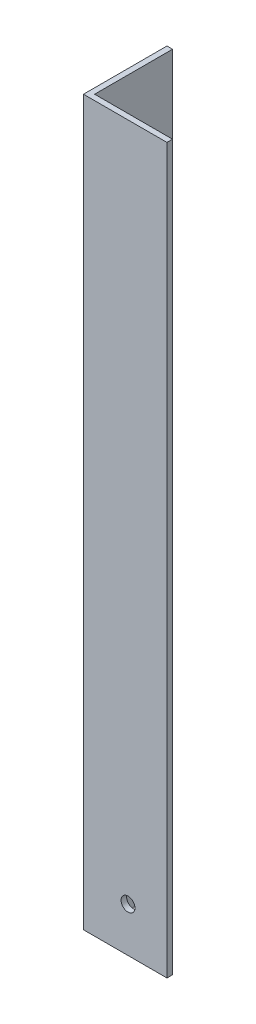
ISO-10303-21;
HEADER;
FILE_DESCRIPTION(('STEP AP214'),'2;1');
FILE_NAME('part.step','',(''),(''),'','','');
FILE_SCHEMA(('AUTOMOTIVE_DESIGN { 1 0 10303 214 1 1 1 1 }'));
ENDSEC;
DATA;
#1=APPLICATION_CONTEXT('core data for automotive mechanical design processes');
#2=APPLICATION_PROTOCOL_DEFINITION('international standard','automotive_design',2000,#1);
#3=PRODUCT_CONTEXT('',#1,'mechanical');
#4=PRODUCT('Part','Part','',(#3));
#5=PRODUCT_RELATED_PRODUCT_CATEGORY('part','',(#4));
#6=PRODUCT_DEFINITION_FORMATION('','',#4);
#7=PRODUCT_DEFINITION_CONTEXT('part definition',#1,'design');
#8=PRODUCT_DEFINITION('design','',#6,#7);
#9=PRODUCT_DEFINITION_SHAPE('','',#8);
#10=(LENGTH_UNIT() NAMED_UNIT(*) SI_UNIT(.MILLI.,.METRE.));
#11=(NAMED_UNIT(*) PLANE_ANGLE_UNIT() SI_UNIT($,.RADIAN.));
#12=(NAMED_UNIT(*) SI_UNIT($,.STERADIAN.) SOLID_ANGLE_UNIT());
#13=UNCERTAINTY_MEASURE_WITH_UNIT(LENGTH_MEASURE(1.E-05),#10,'distance_accuracy_value','');
#14=(GEOMETRIC_REPRESENTATION_CONTEXT(3) GLOBAL_UNCERTAINTY_ASSIGNED_CONTEXT((#13)) GLOBAL_UNIT_ASSIGNED_CONTEXT((#10,
#11,#12)) REPRESENTATION_CONTEXT('',''));
#15=CARTESIAN_POINT('',(0.,0.,0.));
#16=DIRECTION('',(0.,0.,1.));
#17=DIRECTION('',(1.,0.,0.));
#18=AXIS2_PLACEMENT_3D('',#15,#16,#17);
#19=CARTESIAN_POINT('',(0.,130.,0.));
#20=DIRECTION('',(0.,0.,1.));
#21=DIRECTION('',(1.,0.,0.));
#22=AXIS2_PLACEMENT_3D('',#19,#20,#21);
#23=PLANE('',#22);
#24=CARTESIAN_POINT('',(8.,8.,0.));
#25=DIRECTION('',(0.,0.,1.));
#26=DIRECTION('',(1.,0.,0.));
#27=AXIS2_PLACEMENT_3D('',#24,#25,#26);
#28=CIRCLE('',#27,1.24999999999999);
#29=CARTESIAN_POINT('',(9.24999999999999,8.,0.));
#30=VERTEX_POINT('',#29);
#31=EDGE_CURVE('E118',#30,#30,#28,.T.);
#32=ORIENTED_EDGE('',*,*,#31,.T.);
#33=EDGE_LOOP('',(#32));
#34=FACE_BOUND('',#33,.T.);
#35=DIRECTION('',(0.,-1.,0.));
#36=VECTOR('',#35,1.);
#37=CARTESIAN_POINT('',(1.,130.,0.));
#38=LINE('',#37,#36);
#39=CARTESIAN_POINT('',(0.999999999999991,130.,0.));
#40=VERTEX_POINT('',#39);
#41=CARTESIAN_POINT('',(0.999999999999984,0.,0.));
#42=VERTEX_POINT('',#41);
#43=EDGE_CURVE('E49',#40,#42,#38,.T.);
#44=ORIENTED_EDGE('',*,*,#43,.F.);
#45=DIRECTION('',(-1.,0.,0.));
#46=VECTOR('',#45,1.);
#47=CARTESIAN_POINT('',(0.,130.,0.));
#48=LINE('',#47,#46);
#49=CARTESIAN_POINT('',(15.,130.,0.));
#50=VERTEX_POINT('',#49);
#51=EDGE_CURVE('E132',#50,#40,#48,.T.);
#52=ORIENTED_EDGE('',*,*,#51,.F.);
#53=DIRECTION('',(0.,-1.,0.));
#54=VECTOR('',#53,1.);
#55=CARTESIAN_POINT('',(15.,130.,0.));
#56=LINE('',#55,#54);
#57=CARTESIAN_POINT('',(15.,0.,0.));
#58=VERTEX_POINT('',#57);
#59=EDGE_CURVE('E134',#50,#58,#56,.T.);
#60=ORIENTED_EDGE('',*,*,#59,.T.);
#61=DIRECTION('',(-1.,0.,0.));
#62=VECTOR('',#61,1.);
#63=CARTESIAN_POINT('',(0.,0.,0.));
#64=LINE('',#63,#62);
#65=EDGE_CURVE('E102',#58,#42,#64,.T.);
#66=ORIENTED_EDGE('',*,*,#65,.T.);
#67=EDGE_LOOP('',(#44,#52,#60,#66));
#68=FACE_BOUND('',#67,.T.);
#69=ADVANCED_FACE('F34',(#34,#68),#23,.F.);
#70=CARTESIAN_POINT('',(0.,130.,0.));
#71=DIRECTION('',(1.,0.,0.));
#72=DIRECTION('',(0.,0.,-1.));
#73=AXIS2_PLACEMENT_3D('',#70,#71,#72);
#74=PLANE('',#73);
#75=DIRECTION('',(0.,0.,1.));
#76=VECTOR('',#75,1.);
#77=CARTESIAN_POINT('',(0.,0.,0.));
#78=LINE('',#77,#76);
#79=CARTESIAN_POINT('',(0.,0.,-14.));
#80=VERTEX_POINT('',#79);
#81=CARTESIAN_POINT('',(0.,0.,1.));
#82=VERTEX_POINT('',#81);
#83=EDGE_CURVE('E128',#80,#82,#78,.T.);
#84=ORIENTED_EDGE('',*,*,#83,.T.);
#85=DIRECTION('',(0.,-1.,0.));
#86=VECTOR('',#85,1.);
#87=CARTESIAN_POINT('',(0.,130.,1.));
#88=LINE('',#87,#86);
#89=CARTESIAN_POINT('',(0.,130.,1.));
#90=VERTEX_POINT('',#89);
#91=EDGE_CURVE('E11',#90,#82,#88,.T.);
#92=ORIENTED_EDGE('',*,*,#91,.F.);
#93=DIRECTION('',(0.,0.,1.));
#94=VECTOR('',#93,1.);
#95=CARTESIAN_POINT('',(0.,130.,0.));
#96=LINE('',#95,#94);
#97=CARTESIAN_POINT('',(0.,130.,-14.));
#98=VERTEX_POINT('',#97);
#99=EDGE_CURVE('E97',#98,#90,#96,.T.);
#100=ORIENTED_EDGE('',*,*,#99,.F.);
#101=DIRECTION('',(0.,1.,0.));
#102=VECTOR('',#101,1.);
#103=CARTESIAN_POINT('',(0.,130.,-14.));
#104=LINE('',#103,#102);
#105=EDGE_CURVE('E101',#80,#98,#104,.T.);
#106=ORIENTED_EDGE('',*,*,#105,.F.);
#107=EDGE_LOOP('',(#84,#92,#100,#106));
#108=FACE_BOUND('',#107,.T.);
#109=ADVANCED_FACE('F36',(#108),#74,.F.);
#110=CARTESIAN_POINT('',(0.,130.,1.));
#111=DIRECTION('',(0.,0.,-1.));
#112=DIRECTION('',(-1.,0.,0.));
#113=AXIS2_PLACEMENT_3D('',#110,#111,#112);
#114=PLANE('',#113);
#115=CARTESIAN_POINT('',(8.,8.,1.));
#116=DIRECTION('',(0.,0.,1.));
#117=DIRECTION('',(1.,0.,0.));
#118=AXIS2_PLACEMENT_3D('',#115,#116,#117);
#119=CIRCLE('',#118,1.24999999999999);
#120=CARTESIAN_POINT('',(9.24999999999998,8.,1.));
#121=VERTEX_POINT('',#120);
#122=EDGE_CURVE('E173',#121,#121,#119,.T.);
#123=ORIENTED_EDGE('',*,*,#122,.F.);
#124=EDGE_LOOP('',(#123));
#125=FACE_BOUND('',#124,.T.);
#126=DIRECTION('',(1.,0.,0.));
#127=VECTOR('',#126,1.);
#128=CARTESIAN_POINT('',(0.,0.,1.));
#129=LINE('',#128,#127);
#130=CARTESIAN_POINT('',(15.,0.,1.));
#131=VERTEX_POINT('',#130);
#132=EDGE_CURVE('E136',#82,#131,#129,.T.);
#133=ORIENTED_EDGE('',*,*,#132,.T.);
#134=DIRECTION('',(0.,-1.,0.));
#135=VECTOR('',#134,1.);
#136=CARTESIAN_POINT('',(15.,130.,1.));
#137=LINE('',#136,#135);
#138=CARTESIAN_POINT('',(15.,130.,1.));
#139=VERTEX_POINT('',#138);
#140=EDGE_CURVE('E42',#139,#131,#137,.T.);
#141=ORIENTED_EDGE('',*,*,#140,.F.);
#142=DIRECTION('',(1.,0.,0.));
#143=VECTOR('',#142,1.);
#144=CARTESIAN_POINT('',(0.,130.,1.));
#145=LINE('',#144,#143);
#146=EDGE_CURVE('E79',#90,#139,#145,.T.);
#147=ORIENTED_EDGE('',*,*,#146,.F.);
#148=ORIENTED_EDGE('',*,*,#91,.T.);
#149=EDGE_LOOP('',(#133,#141,#147,#148));
#150=FACE_BOUND('',#149,.T.);
#151=ADVANCED_FACE('F163',(#125,#150),#114,.F.);
#152=CARTESIAN_POINT('',(15.,130.,0.));
#153=DIRECTION('',(-1.,0.,0.));
#154=DIRECTION('',(0.,0.,1.));
#155=AXIS2_PLACEMENT_3D('',#152,#153,#154);
#156=PLANE('',#155);
#157=DIRECTION('',(0.,0.,-1.));
#158=VECTOR('',#157,1.);
#159=CARTESIAN_POINT('',(15.,0.,0.));
#160=LINE('',#159,#158);
#161=EDGE_CURVE('E74',#131,#58,#160,.T.);
#162=ORIENTED_EDGE('',*,*,#161,.T.);
#163=ORIENTED_EDGE('',*,*,#59,.F.);
#164=DIRECTION('',(0.,0.,-1.));
#165=VECTOR('',#164,1.);
#166=CARTESIAN_POINT('',(15.,130.,0.));
#167=LINE('',#166,#165);
#168=EDGE_CURVE('E57',#139,#50,#167,.T.);
#169=ORIENTED_EDGE('',*,*,#168,.F.);
#170=ORIENTED_EDGE('',*,*,#140,.T.);
#171=EDGE_LOOP('',(#162,#163,#169,#170));
#172=FACE_BOUND('',#171,.T.);
#173=ADVANCED_FACE('F140',(#172),#156,.F.);
#174=CARTESIAN_POINT('',(0.,130.,0.));
#175=DIRECTION('',(0.,1.,0.));
#176=DIRECTION('',(0.,0.,1.));
#177=AXIS2_PLACEMENT_3D('',#174,#175,#176);
#178=PLANE('',#177);
#179=ORIENTED_EDGE('',*,*,#99,.T.);
#180=ORIENTED_EDGE('',*,*,#146,.T.);
#181=ORIENTED_EDGE('',*,*,#168,.T.);
#182=ORIENTED_EDGE('',*,*,#51,.T.);
#183=DIRECTION('',(0.,0.,1.));
#184=VECTOR('',#183,1.);
#185=CARTESIAN_POINT('',(1.,130.,-14.));
#186=LINE('',#185,#184);
#187=CARTESIAN_POINT('',(1.,130.,-14.));
#188=VERTEX_POINT('',#187);
#189=EDGE_CURVE('E108',#188,#40,#186,.T.);
#190=ORIENTED_EDGE('',*,*,#189,.F.);
#191=DIRECTION('',(1.,0.,0.));
#192=VECTOR('',#191,1.);
#193=CARTESIAN_POINT('',(0.,130.,-14.));
#194=LINE('',#193,#192);
#195=EDGE_CURVE('E105',#98,#188,#194,.T.);
#196=ORIENTED_EDGE('',*,*,#195,.F.);
#197=EDGE_LOOP('',(#179,#180,#181,#182,#190,#196));
#198=FACE_BOUND('',#197,.T.);
#199=ADVANCED_FACE('F106',(#198),#178,.T.);
#200=CARTESIAN_POINT('',(0.,0.,0.));
#201=DIRECTION('',(0.,1.,0.));
#202=DIRECTION('',(0.,0.,1.));
#203=AXIS2_PLACEMENT_3D('',#200,#201,#202);
#204=PLANE('',#203);
#205=ORIENTED_EDGE('',*,*,#83,.F.);
#206=DIRECTION('',(-1.,0.,0.));
#207=VECTOR('',#206,1.);
#208=CARTESIAN_POINT('',(0.,0.,-14.));
#209=LINE('',#208,#207);
#210=CARTESIAN_POINT('',(0.999999999999984,0.,-14.));
#211=VERTEX_POINT('',#210);
#212=EDGE_CURVE('E116',#211,#80,#209,.T.);
#213=ORIENTED_EDGE('',*,*,#212,.F.);
#214=DIRECTION('',(0.,0.,1.));
#215=VECTOR('',#214,1.);
#216=CARTESIAN_POINT('',(0.999999999999984,0.,-14.));
#217=LINE('',#216,#215);
#218=EDGE_CURVE('E124',#211,#42,#217,.T.);
#219=ORIENTED_EDGE('',*,*,#218,.T.);
#220=ORIENTED_EDGE('',*,*,#65,.F.);
#221=ORIENTED_EDGE('',*,*,#161,.F.);
#222=ORIENTED_EDGE('',*,*,#132,.F.);
#223=EDGE_LOOP('',(#205,#213,#219,#220,#221,#222));
#224=FACE_BOUND('',#223,.T.);
#225=ADVANCED_FACE('F143',(#224),#204,.F.);
#226=CARTESIAN_POINT('',(1.,130.,-14.));
#227=DIRECTION('',(-1.,0.,0.));
#228=DIRECTION('',(0.,-1.,0.));
#229=AXIS2_PLACEMENT_3D('',#226,#227,#228);
#230=PLANE('',#229);
#231=ORIENTED_EDGE('',*,*,#43,.T.);
#232=ORIENTED_EDGE('',*,*,#218,.F.);
#233=DIRECTION('',(0.,-1.,0.));
#234=VECTOR('',#233,1.);
#235=CARTESIAN_POINT('',(1.,130.,-14.));
#236=LINE('',#235,#234);
#237=EDGE_CURVE('E111',#188,#211,#236,.T.);
#238=ORIENTED_EDGE('',*,*,#237,.F.);
#239=ORIENTED_EDGE('',*,*,#189,.T.);
#240=EDGE_LOOP('',(#231,#232,#238,#239));
#241=FACE_BOUND('',#240,.T.);
#242=ADVANCED_FACE('F146',(#241),#230,.F.);
#243=CARTESIAN_POINT('',(0.,0.,-14.));
#244=DIRECTION('',(0.,0.,1.));
#245=DIRECTION('',(1.,0.,0.));
#246=AXIS2_PLACEMENT_3D('',#243,#244,#245);
#247=PLANE('',#246);
#248=ORIENTED_EDGE('',*,*,#105,.T.);
#249=ORIENTED_EDGE('',*,*,#195,.T.);
#250=ORIENTED_EDGE('',*,*,#237,.T.);
#251=ORIENTED_EDGE('',*,*,#212,.T.);
#252=EDGE_LOOP('',(#248,#249,#250,#251));
#253=FACE_BOUND('',#252,.T.);
#254=ADVANCED_FACE('F114',(#253),#247,.F.);
#255=CARTESIAN_POINT('',(8.,8.,1.));
#256=DIRECTION('',(0.,0.,1.));
#257=DIRECTION('',(1.,0.,0.));
#258=AXIS2_PLACEMENT_3D('',#255,#256,#257);
#259=CYLINDRICAL_SURFACE('',#258,1.24999999999999);
#260=ORIENTED_EDGE('',*,*,#122,.T.);
#261=EDGE_LOOP('',(#260));
#262=FACE_BOUND('',#261,.T.);
#263=ORIENTED_EDGE('',*,*,#31,.F.);
#264=EDGE_LOOP('',(#263));
#265=FACE_BOUND('',#264,.T.);
#266=ADVANCED_FACE('F153',(#262,#265),#259,.F.);
#267=CLOSED_SHELL('',(#69,#109,#151,#173,#199,#225,#242,#254,#266));
#268=MANIFOLD_SOLID_BREP('B2',#267);
#269=ADVANCED_BREP_SHAPE_REPRESENTATION('',(#18,#268),#14);
#270=SHAPE_DEFINITION_REPRESENTATION(#9,#269);
ENDSEC;
END-ISO-10303-21;
